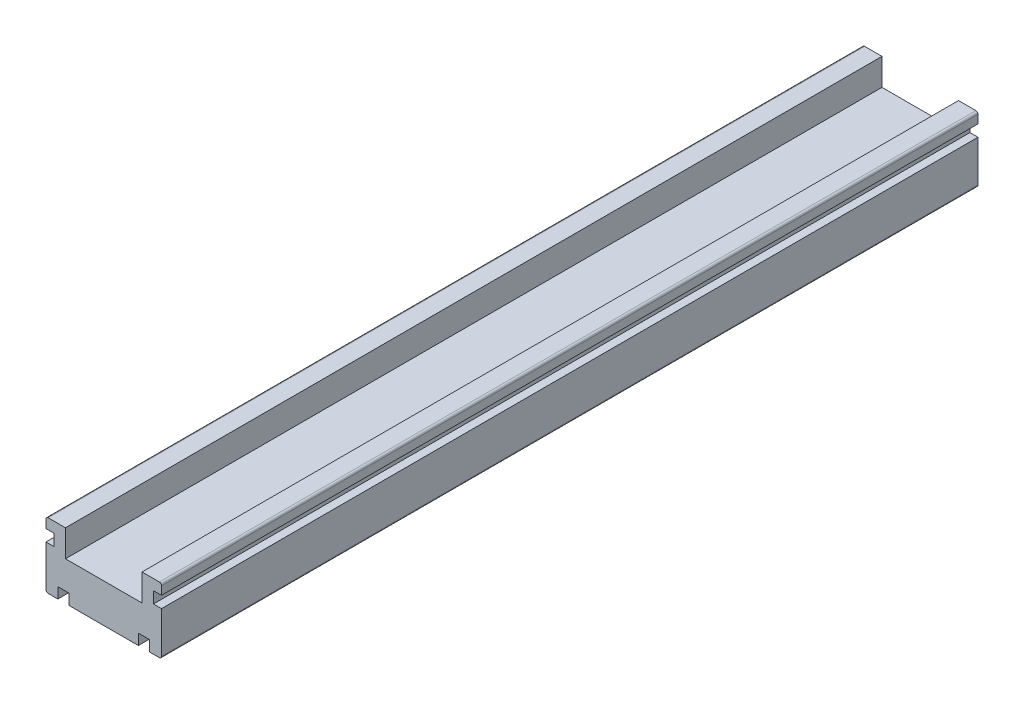
ISO-10303-21;
HEADER;
FILE_DESCRIPTION(('STEP AP214'),'2;1');
FILE_NAME('part.step','',(''),(''),'','','');
FILE_SCHEMA(('AUTOMOTIVE_DESIGN { 1 0 10303 214 1 1 1 1 }'));
ENDSEC;
DATA;
#1=APPLICATION_CONTEXT('core data for automotive mechanical design processes');
#2=APPLICATION_PROTOCOL_DEFINITION('international standard','automotive_design',2000,#1);
#3=PRODUCT_CONTEXT('',#1,'mechanical');
#4=PRODUCT('Part','Part','',(#3));
#5=PRODUCT_RELATED_PRODUCT_CATEGORY('part','',(#4));
#6=PRODUCT_DEFINITION_FORMATION('','',#4);
#7=PRODUCT_DEFINITION_CONTEXT('part definition',#1,'design');
#8=PRODUCT_DEFINITION('design','',#6,#7);
#9=PRODUCT_DEFINITION_SHAPE('','',#8);
#10=(LENGTH_UNIT() NAMED_UNIT(*) SI_UNIT(.MILLI.,.METRE.));
#11=(NAMED_UNIT(*) PLANE_ANGLE_UNIT() SI_UNIT($,.RADIAN.));
#12=(NAMED_UNIT(*) SI_UNIT($,.STERADIAN.) SOLID_ANGLE_UNIT());
#13=UNCERTAINTY_MEASURE_WITH_UNIT(LENGTH_MEASURE(1.E-05),#10,'distance_accuracy_value','');
#14=(GEOMETRIC_REPRESENTATION_CONTEXT(3) GLOBAL_UNCERTAINTY_ASSIGNED_CONTEXT((#13)) GLOBAL_UNIT_ASSIGNED_CONTEXT((#10,
#11,#12)) REPRESENTATION_CONTEXT('',''));
#15=CARTESIAN_POINT('',(0.,0.,0.));
#16=DIRECTION('',(0.,0.,1.));
#17=DIRECTION('',(1.,0.,0.));
#18=AXIS2_PLACEMENT_3D('',#15,#16,#17);
#19=CARTESIAN_POINT('',(-21.5,-12.2,304.));
#20=DIRECTION('',(0.,1.,0.));
#21=DIRECTION('',(0.,0.,1.));
#22=AXIS2_PLACEMENT_3D('',#19,#20,#21);
#23=PLANE('',#22);
#24=DIRECTION('',(1.,0.,0.));
#25=VECTOR('',#24,1.);
#26=CARTESIAN_POINT('',(-21.5,-12.2,0.));
#27=LINE('',#26,#25);
#28=CARTESIAN_POINT('',(-12.9,-12.2,0.));
#29=VERTEX_POINT('',#28);
#30=CARTESIAN_POINT('',(12.9,-12.2,0.));
#31=VERTEX_POINT('',#30);
#32=EDGE_CURVE('E387',#29,#31,#27,.T.);
#33=ORIENTED_EDGE('',*,*,#32,.T.);
#34=DIRECTION('',(0.,0.,1.));
#35=VECTOR('',#34,1.);
#36=CARTESIAN_POINT('',(12.9,-12.2,304.));
#37=LINE('',#36,#35);
#38=CARTESIAN_POINT('',(12.9,-12.2,304.));
#39=VERTEX_POINT('',#38);
#40=EDGE_CURVE('E274',#31,#39,#37,.T.);
#41=ORIENTED_EDGE('',*,*,#40,.T.);
#42=DIRECTION('',(1.,0.,0.));
#43=VECTOR('',#42,1.);
#44=CARTESIAN_POINT('',(-21.5,-12.2,304.));
#45=LINE('',#44,#43);
#46=CARTESIAN_POINT('',(-12.9,-12.2,304.));
#47=VERTEX_POINT('',#46);
#48=EDGE_CURVE('E241',#47,#39,#45,.T.);
#49=ORIENTED_EDGE('',*,*,#48,.F.);
#50=DIRECTION('',(0.,0.,-1.));
#51=VECTOR('',#50,1.);
#52=CARTESIAN_POINT('',(-12.9,-12.2,304.));
#53=LINE('',#52,#51);
#54=EDGE_CURVE('E250',#47,#29,#53,.T.);
#55=ORIENTED_EDGE('',*,*,#54,.T.);
#56=EDGE_LOOP('',(#33,#41,#49,#55));
#57=FACE_BOUND('',#56,.T.);
#58=ADVANCED_FACE('F37',(#57),#23,.F.);
#59=CARTESIAN_POINT('',(-20.7,-12.2,0.));
#60=VERTEX_POINT('',#59);
#61=CARTESIAN_POINT('',(-17.1,-12.2,0.));
#62=VERTEX_POINT('',#61);
#63=EDGE_CURVE('E384',#60,#62,#27,.T.);
#64=ORIENTED_EDGE('',*,*,#63,.T.);
#65=DIRECTION('',(0.,0.,1.));
#66=VECTOR('',#65,1.);
#67=CARTESIAN_POINT('',(-17.1,-12.2,304.));
#68=LINE('',#67,#66);
#69=CARTESIAN_POINT('',(-17.1,-12.2,304.));
#70=VERTEX_POINT('',#69);
#71=EDGE_CURVE('E268',#62,#70,#68,.T.);
#72=ORIENTED_EDGE('',*,*,#71,.T.);
#73=CARTESIAN_POINT('',(-20.7,-12.2,304.));
#74=VERTEX_POINT('',#73);
#75=EDGE_CURVE('E368',#74,#70,#45,.T.);
#76=ORIENTED_EDGE('',*,*,#75,.F.);
#77=DIRECTION('',(0.,0.,-1.));
#78=VECTOR('',#77,1.);
#79=CARTESIAN_POINT('',(-20.7,-12.2,304.));
#80=LINE('',#79,#78);
#81=EDGE_CURVE('E405',#74,#60,#80,.T.);
#82=ORIENTED_EDGE('',*,*,#81,.T.);
#83=EDGE_LOOP('',(#64,#72,#76,#82));
#84=FACE_BOUND('',#83,.T.);
#85=ADVANCED_FACE('F445',(#84),#23,.F.);
#86=CARTESIAN_POINT('',(-21.5,12.2,304.));
#87=DIRECTION('',(0.,-1.,0.));
#88=DIRECTION('',(0.,0.,-1.));
#89=AXIS2_PLACEMENT_3D('',#86,#87,#88);
#90=PLANE('',#89);
#91=DIRECTION('',(-1.,0.,0.));
#92=VECTOR('',#91,1.);
#93=CARTESIAN_POINT('',(-21.5,12.2,304.));
#94=LINE('',#93,#92);
#95=CARTESIAN_POINT('',(-14.25,12.2,304.));
#96=VERTEX_POINT('',#95);
#97=CARTESIAN_POINT('',(-20.7,12.2,304.));
#98=VERTEX_POINT('',#97);
#99=EDGE_CURVE('E358',#96,#98,#94,.T.);
#100=ORIENTED_EDGE('',*,*,#99,.F.);
#101=DIRECTION('',(0.,0.,-1.));
#102=VECTOR('',#101,1.);
#103=CARTESIAN_POINT('',(-14.25,12.2,304.));
#104=LINE('',#103,#102);
#105=CARTESIAN_POINT('',(-14.25,12.2,0.));
#106=VERTEX_POINT('',#105);
#107=EDGE_CURVE('E294',#96,#106,#104,.T.);
#108=ORIENTED_EDGE('',*,*,#107,.T.);
#109=DIRECTION('',(-1.,0.,0.));
#110=VECTOR('',#109,1.);
#111=CARTESIAN_POINT('',(-21.5,12.2,0.));
#112=LINE('',#111,#110);
#113=CARTESIAN_POINT('',(-20.7,12.2,0.));
#114=VERTEX_POINT('',#113);
#115=EDGE_CURVE('E375',#106,#114,#112,.T.);
#116=ORIENTED_EDGE('',*,*,#115,.T.);
#117=DIRECTION('',(0.,0.,-1.));
#118=VECTOR('',#117,1.);
#119=CARTESIAN_POINT('',(-20.7,12.2,304.));
#120=LINE('',#119,#118);
#121=EDGE_CURVE('E428',#114,#98,#120,.F.);
#122=ORIENTED_EDGE('',*,*,#121,.T.);
#123=EDGE_LOOP('',(#100,#108,#116,#122));
#124=FACE_BOUND('',#123,.T.);
#125=ADVANCED_FACE('F480',(#124),#90,.F.);
#126=CARTESIAN_POINT('',(21.5,-12.2,304.));
#127=DIRECTION('',(-1.,0.,0.));
#128=DIRECTION('',(0.,0.,1.));
#129=AXIS2_PLACEMENT_3D('',#126,#127,#128);
#130=PLANE('',#129);
#131=DIRECTION('',(0.,1.,0.));
#132=VECTOR('',#131,1.);
#133=CARTESIAN_POINT('',(21.5,-12.2,304.));
#134=LINE('',#133,#132);
#135=CARTESIAN_POINT('',(21.5,8.3,304.));
#136=VERTEX_POINT('',#135);
#137=CARTESIAN_POINT('',(21.5,11.4,304.));
#138=VERTEX_POINT('',#137);
#139=EDGE_CURVE('E359',#136,#138,#134,.T.);
#140=ORIENTED_EDGE('',*,*,#139,.F.);
#141=DIRECTION('',(0.,0.,-1.));
#142=VECTOR('',#141,1.);
#143=CARTESIAN_POINT('',(21.5,8.3,304.));
#144=LINE('',#143,#142);
#145=CARTESIAN_POINT('',(21.5,8.3,0.));
#146=VERTEX_POINT('',#145);
#147=EDGE_CURVE('E322',#136,#146,#144,.T.);
#148=ORIENTED_EDGE('',*,*,#147,.T.);
#149=DIRECTION('',(0.,1.,0.));
#150=VECTOR('',#149,1.);
#151=CARTESIAN_POINT('',(21.5,-12.2,0.));
#152=LINE('',#151,#150);
#153=CARTESIAN_POINT('',(21.5,11.4,0.));
#154=VERTEX_POINT('',#153);
#155=EDGE_CURVE('E325',#146,#154,#152,.T.);
#156=ORIENTED_EDGE('',*,*,#155,.T.);
#157=DIRECTION('',(0.,0.,-1.));
#158=VECTOR('',#157,1.);
#159=CARTESIAN_POINT('',(21.5,11.4,304.));
#160=LINE('',#159,#158);
#161=EDGE_CURVE('E371',#154,#138,#160,.F.);
#162=ORIENTED_EDGE('',*,*,#161,.T.);
#163=EDGE_LOOP('',(#140,#148,#156,#162));
#164=FACE_BOUND('',#163,.T.);
#165=ADVANCED_FACE('F503',(#164),#130,.F.);
#166=CARTESIAN_POINT('',(-21.5,-12.2,304.));
#167=DIRECTION('',(1.,0.,0.));
#168=DIRECTION('',(0.,0.,-1.));
#169=AXIS2_PLACEMENT_3D('',#166,#167,#168);
#170=PLANE('',#169);
#171=DIRECTION('',(0.,-1.,0.));
#172=VECTOR('',#171,1.);
#173=CARTESIAN_POINT('',(-21.5,-12.2,0.));
#174=LINE('',#173,#172);
#175=CARTESIAN_POINT('',(-21.5,11.4,0.));
#176=VERTEX_POINT('',#175);
#177=CARTESIAN_POINT('',(-21.5,8.3,0.));
#178=VERTEX_POINT('',#177);
#179=EDGE_CURVE('E380',#176,#178,#174,.T.);
#180=ORIENTED_EDGE('',*,*,#179,.T.);
#181=DIRECTION('',(0.,0.,-1.));
#182=VECTOR('',#181,1.);
#183=CARTESIAN_POINT('',(-21.5,8.3,304.));
#184=LINE('',#183,#182);
#185=CARTESIAN_POINT('',(-21.5,8.3,304.));
#186=VERTEX_POINT('',#185);
#187=EDGE_CURVE('E318',#186,#178,#184,.T.);
#188=ORIENTED_EDGE('',*,*,#187,.F.);
#189=DIRECTION('',(0.,-1.,0.));
#190=VECTOR('',#189,1.);
#191=CARTESIAN_POINT('',(-21.5,-12.2,304.));
#192=LINE('',#191,#190);
#193=CARTESIAN_POINT('',(-21.5,11.4,304.));
#194=VERTEX_POINT('',#193);
#195=EDGE_CURVE('E364',#194,#186,#192,.T.);
#196=ORIENTED_EDGE('',*,*,#195,.F.);
#197=DIRECTION('',(0.,0.,-1.));
#198=VECTOR('',#197,1.);
#199=CARTESIAN_POINT('',(-21.5,11.4,304.));
#200=LINE('',#199,#198);
#201=EDGE_CURVE('E419',#194,#176,#200,.T.);
#202=ORIENTED_EDGE('',*,*,#201,.T.);
#203=EDGE_LOOP('',(#180,#188,#196,#202));
#204=FACE_BOUND('',#203,.T.);
#205=ADVANCED_FACE('F468',(#204),#170,.F.);
#206=CARTESIAN_POINT('',(21.5,-11.4,0.));
#207=VERTEX_POINT('',#206);
#208=CARTESIAN_POINT('',(21.5,4.,0.));
#209=VERTEX_POINT('',#208);
#210=EDGE_CURVE('E372',#207,#209,#152,.T.);
#211=ORIENTED_EDGE('',*,*,#210,.T.);
#212=DIRECTION('',(0.,0.,-1.));
#213=VECTOR('',#212,1.);
#214=CARTESIAN_POINT('',(21.5,4.,304.));
#215=LINE('',#214,#213);
#216=CARTESIAN_POINT('',(21.5,4.,304.));
#217=VERTEX_POINT('',#216);
#218=EDGE_CURVE('E313',#217,#209,#215,.T.);
#219=ORIENTED_EDGE('',*,*,#218,.F.);
#220=CARTESIAN_POINT('',(21.5,-11.4,304.));
#221=VERTEX_POINT('',#220);
#222=EDGE_CURVE('E355',#221,#217,#134,.T.);
#223=ORIENTED_EDGE('',*,*,#222,.F.);
#224=DIRECTION('',(0.,0.,-1.));
#225=VECTOR('',#224,1.);
#226=CARTESIAN_POINT('',(21.5,-11.4,304.));
#227=LINE('',#226,#225);
#228=EDGE_CURVE('E390',#221,#207,#227,.T.);
#229=ORIENTED_EDGE('',*,*,#228,.T.);
#230=EDGE_LOOP('',(#211,#219,#223,#229));
#231=FACE_BOUND('',#230,.T.);
#232=ADVANCED_FACE('F515',(#231),#130,.F.);
#233=CARTESIAN_POINT('',(20.7,12.2,0.));
#234=VERTEX_POINT('',#233);
#235=CARTESIAN_POINT('',(14.25,12.2,0.));
#236=VERTEX_POINT('',#235);
#237=EDGE_CURVE('E376',#234,#236,#112,.T.);
#238=ORIENTED_EDGE('',*,*,#237,.T.);
#239=DIRECTION('',(0.,0.,-1.));
#240=VECTOR('',#239,1.);
#241=CARTESIAN_POINT('',(14.25,12.2,304.));
#242=LINE('',#241,#240);
#243=CARTESIAN_POINT('',(14.25,12.2,304.));
#244=VERTEX_POINT('',#243);
#245=EDGE_CURVE('E287',#244,#236,#242,.T.);
#246=ORIENTED_EDGE('',*,*,#245,.F.);
#247=CARTESIAN_POINT('',(20.7,12.2,304.));
#248=VERTEX_POINT('',#247);
#249=EDGE_CURVE('E360',#248,#244,#94,.T.);
#250=ORIENTED_EDGE('',*,*,#249,.F.);
#251=DIRECTION('',(0.,0.,-1.));
#252=VECTOR('',#251,1.);
#253=CARTESIAN_POINT('',(20.7,12.2,304.));
#254=LINE('',#253,#252);
#255=EDGE_CURVE('E425',#248,#234,#254,.T.);
#256=ORIENTED_EDGE('',*,*,#255,.T.);
#257=EDGE_LOOP('',(#238,#246,#250,#256));
#258=FACE_BOUND('',#257,.T.);
#259=ADVANCED_FACE('F492',(#258),#90,.F.);
#260=CARTESIAN_POINT('',(-21.5,4.,304.));
#261=VERTEX_POINT('',#260);
#262=CARTESIAN_POINT('',(-21.5,-11.4,304.));
#263=VERTEX_POINT('',#262);
#264=EDGE_CURVE('E363',#261,#263,#192,.T.);
#265=ORIENTED_EDGE('',*,*,#264,.F.);
#266=DIRECTION('',(0.,0.,-1.));
#267=VECTOR('',#266,1.);
#268=CARTESIAN_POINT('',(-21.5,4.,304.));
#269=LINE('',#268,#267);
#270=CARTESIAN_POINT('',(-21.5,4.,0.));
#271=VERTEX_POINT('',#270);
#272=EDGE_CURVE('E348',#261,#271,#269,.T.);
#273=ORIENTED_EDGE('',*,*,#272,.T.);
#274=CARTESIAN_POINT('',(-21.5,-11.4,0.));
#275=VERTEX_POINT('',#274);
#276=EDGE_CURVE('E379',#271,#275,#174,.T.);
#277=ORIENTED_EDGE('',*,*,#276,.T.);
#278=DIRECTION('',(0.,0.,-1.));
#279=VECTOR('',#278,1.);
#280=CARTESIAN_POINT('',(-21.5,-11.4,304.));
#281=LINE('',#280,#279);
#282=EDGE_CURVE('E422',#275,#263,#281,.F.);
#283=ORIENTED_EDGE('',*,*,#282,.T.);
#284=EDGE_LOOP('',(#265,#273,#277,#283));
#285=FACE_BOUND('',#284,.T.);
#286=ADVANCED_FACE('F455',(#285),#170,.F.);
#287=CARTESIAN_POINT('',(17.1,-12.2,304.));
#288=VERTEX_POINT('',#287);
#289=CARTESIAN_POINT('',(20.7,-12.2,304.));
#290=VERTEX_POINT('',#289);
#291=EDGE_CURVE('E367',#288,#290,#45,.T.);
#292=ORIENTED_EDGE('',*,*,#291,.F.);
#293=DIRECTION('',(0.,0.,-1.));
#294=VECTOR('',#293,1.);
#295=CARTESIAN_POINT('',(17.1,-12.2,304.));
#296=LINE('',#295,#294);
#297=CARTESIAN_POINT('',(17.1,-12.2,0.));
#298=VERTEX_POINT('',#297);
#299=EDGE_CURVE('E271',#288,#298,#296,.T.);
#300=ORIENTED_EDGE('',*,*,#299,.T.);
#301=CARTESIAN_POINT('',(20.7,-12.2,0.));
#302=VERTEX_POINT('',#301);
#303=EDGE_CURVE('E383',#298,#302,#27,.T.);
#304=ORIENTED_EDGE('',*,*,#303,.T.);
#305=DIRECTION('',(0.,0.,-1.));
#306=VECTOR('',#305,1.);
#307=CARTESIAN_POINT('',(20.7,-12.2,304.));
#308=LINE('',#307,#306);
#309=EDGE_CURVE('E408',#302,#290,#308,.F.);
#310=ORIENTED_EDGE('',*,*,#309,.T.);
#311=EDGE_LOOP('',(#292,#300,#304,#310));
#312=FACE_BOUND('',#311,.T.);
#313=ADVANCED_FACE('F528',(#312),#23,.F.);
#314=CARTESIAN_POINT('',(0.,0.,304.));
#315=DIRECTION('',(0.,0.,-1.));
#316=DIRECTION('',(-1.,0.,0.));
#317=AXIS2_PLACEMENT_3D('',#314,#315,#316);
#318=PLANE('',#317);
#319=ORIENTED_EDGE('',*,*,#48,.T.);
#320=DIRECTION('',(0.,1.,0.));
#321=VECTOR('',#320,1.);
#322=CARTESIAN_POINT('',(12.9,-16.2,304.));
#323=LINE('',#322,#321);
#324=CARTESIAN_POINT('',(12.9,-8.2,304.));
#325=VERTEX_POINT('',#324);
#326=EDGE_CURVE('E223',#39,#325,#323,.T.);
#327=ORIENTED_EDGE('',*,*,#326,.T.);
#328=DIRECTION('',(1.,0.,0.));
#329=VECTOR('',#328,1.);
#330=CARTESIAN_POINT('',(17.1,-8.2,304.));
#331=LINE('',#330,#329);
#332=CARTESIAN_POINT('',(17.1,-8.2,304.));
#333=VERTEX_POINT('',#332);
#334=EDGE_CURVE('E231',#325,#333,#331,.T.);
#335=ORIENTED_EDGE('',*,*,#334,.T.);
#336=DIRECTION('',(0.,-1.,0.));
#337=VECTOR('',#336,1.);
#338=CARTESIAN_POINT('',(17.1,-16.2,304.));
#339=LINE('',#338,#337);
#340=EDGE_CURVE('E228',#333,#288,#339,.T.);
#341=ORIENTED_EDGE('',*,*,#340,.T.);
#342=ORIENTED_EDGE('',*,*,#291,.T.);
#343=CARTESIAN_POINT('',(20.7,-11.4,304.));
#344=DIRECTION('',(0.,0.,-1.));
#345=DIRECTION('',(-1.,0.,0.));
#346=AXIS2_PLACEMENT_3D('',#343,#344,#345);
#347=CIRCLE('',#346,0.8);
#348=EDGE_CURVE('E417',#290,#221,#347,.F.);
#349=ORIENTED_EDGE('',*,*,#348,.T.);
#350=ORIENTED_EDGE('',*,*,#222,.T.);
#351=DIRECTION('',(-1.,0.,0.));
#352=VECTOR('',#351,1.);
#353=CARTESIAN_POINT('',(21.5,4.,304.));
#354=LINE('',#353,#352);
#355=CARTESIAN_POINT('',(18.5,4.,304.));
#356=VERTEX_POINT('',#355);
#357=EDGE_CURVE('E303',#217,#356,#354,.T.);
#358=ORIENTED_EDGE('',*,*,#357,.T.);
#359=DIRECTION('',(0.,1.,0.));
#360=VECTOR('',#359,1.);
#361=CARTESIAN_POINT('',(18.5,8.3,304.));
#362=LINE('',#361,#360);
#363=CARTESIAN_POINT('',(18.5,8.3,304.));
#364=VERTEX_POINT('',#363);
#365=EDGE_CURVE('E306',#356,#364,#362,.T.);
#366=ORIENTED_EDGE('',*,*,#365,.T.);
#367=DIRECTION('',(1.,0.,0.));
#368=VECTOR('',#367,1.);
#369=CARTESIAN_POINT('',(21.5,8.3,304.));
#370=LINE('',#369,#368);
#371=EDGE_CURVE('E310',#364,#136,#370,.T.);
#372=ORIENTED_EDGE('',*,*,#371,.T.);
#373=ORIENTED_EDGE('',*,*,#139,.T.);
#374=CARTESIAN_POINT('',(20.7,11.4,304.));
#375=DIRECTION('',(0.,0.,-1.));
#376=DIRECTION('',(-1.,0.,0.));
#377=AXIS2_PLACEMENT_3D('',#374,#375,#376);
#378=CIRCLE('',#377,0.8);
#379=EDGE_CURVE('E411',#138,#248,#378,.F.);
#380=ORIENTED_EDGE('',*,*,#379,.T.);
#381=ORIENTED_EDGE('',*,*,#249,.T.);
#382=DIRECTION('',(0.,-1.,0.));
#383=VECTOR('',#382,1.);
#384=CARTESIAN_POINT('',(14.25,12.2,304.));
#385=LINE('',#384,#383);
#386=CARTESIAN_POINT('',(14.25,2.2,304.));
#387=VERTEX_POINT('',#386);
#388=EDGE_CURVE('E277',#244,#387,#385,.T.);
#389=ORIENTED_EDGE('',*,*,#388,.T.);
#390=DIRECTION('',(-1.,0.,0.));
#391=VECTOR('',#390,1.);
#392=CARTESIAN_POINT('',(14.25,2.2,304.));
#393=LINE('',#392,#391);
#394=CARTESIAN_POINT('',(-14.25,2.2,304.));
#395=VERTEX_POINT('',#394);
#396=EDGE_CURVE('E280',#387,#395,#393,.T.);
#397=ORIENTED_EDGE('',*,*,#396,.T.);
#398=DIRECTION('',(0.,1.,0.));
#399=VECTOR('',#398,1.);
#400=CARTESIAN_POINT('',(-14.25,2.2,304.));
#401=LINE('',#400,#399);
#402=EDGE_CURVE('E284',#395,#96,#401,.T.);
#403=ORIENTED_EDGE('',*,*,#402,.T.);
#404=ORIENTED_EDGE('',*,*,#99,.T.);
#405=CARTESIAN_POINT('',(-20.7,11.4,304.));
#406=DIRECTION('',(0.,0.,-1.));
#407=DIRECTION('',(-1.,0.,0.));
#408=AXIS2_PLACEMENT_3D('',#405,#406,#407);
#409=CIRCLE('',#408,0.8);
#410=EDGE_CURVE('E413',#98,#194,#409,.F.);
#411=ORIENTED_EDGE('',*,*,#410,.T.);
#412=ORIENTED_EDGE('',*,*,#195,.T.);
#413=DIRECTION('',(1.,0.,0.));
#414=VECTOR('',#413,1.);
#415=CARTESIAN_POINT('',(-21.5,8.3,304.));
#416=LINE('',#415,#414);
#417=CARTESIAN_POINT('',(-18.5,8.3,304.));
#418=VERTEX_POINT('',#417);
#419=EDGE_CURVE('E331',#186,#418,#416,.T.);
#420=ORIENTED_EDGE('',*,*,#419,.T.);
#421=DIRECTION('',(0.,-1.,0.));
#422=VECTOR('',#421,1.);
#423=CARTESIAN_POINT('',(-18.5,8.3,304.));
#424=LINE('',#423,#422);
#425=CARTESIAN_POINT('',(-18.5,4.,304.));
#426=VERTEX_POINT('',#425);
#427=EDGE_CURVE('E334',#418,#426,#424,.T.);
#428=ORIENTED_EDGE('',*,*,#427,.T.);
#429=DIRECTION('',(-1.,0.,0.));
#430=VECTOR('',#429,1.);
#431=CARTESIAN_POINT('',(-21.5,4.,304.));
#432=LINE('',#431,#430);
#433=EDGE_CURVE('E338',#426,#261,#432,.T.);
#434=ORIENTED_EDGE('',*,*,#433,.T.);
#435=ORIENTED_EDGE('',*,*,#264,.T.);
#436=CARTESIAN_POINT('',(-20.7,-11.4,304.));
#437=DIRECTION('',(0.,0.,-1.));
#438=DIRECTION('',(-1.,0.,0.));
#439=AXIS2_PLACEMENT_3D('',#436,#437,#438);
#440=CIRCLE('',#439,0.8);
#441=EDGE_CURVE('E415',#263,#74,#440,.F.);
#442=ORIENTED_EDGE('',*,*,#441,.T.);
#443=ORIENTED_EDGE('',*,*,#75,.T.);
#444=DIRECTION('',(0.,1.,0.));
#445=VECTOR('',#444,1.);
#446=CARTESIAN_POINT('',(-17.1,-16.2,304.));
#447=LINE('',#446,#445);
#448=CARTESIAN_POINT('',(-17.1,-8.2,304.));
#449=VERTEX_POINT('',#448);
#450=EDGE_CURVE('E252',#70,#449,#447,.T.);
#451=ORIENTED_EDGE('',*,*,#450,.T.);
#452=DIRECTION('',(1.,0.,0.));
#453=VECTOR('',#452,1.);
#454=CARTESIAN_POINT('',(-12.9,-8.2,304.));
#455=LINE('',#454,#453);
#456=CARTESIAN_POINT('',(-12.9,-8.2,304.));
#457=VERTEX_POINT('',#456);
#458=EDGE_CURVE('E255',#449,#457,#455,.T.);
#459=ORIENTED_EDGE('',*,*,#458,.T.);
#460=DIRECTION('',(0.,-1.,0.));
#461=VECTOR('',#460,1.);
#462=CARTESIAN_POINT('',(-12.9,-16.2,304.));
#463=LINE('',#462,#461);
#464=EDGE_CURVE('E259',#457,#47,#463,.T.);
#465=ORIENTED_EDGE('',*,*,#464,.T.);
#466=EDGE_LOOP('',(#319,#327,#335,#341,#342,#349,#350,#358,#366,#372,#373,#380,#381,#389,#397,
#403,#404,#411,#412,#420,#428,#434,#435,#442,#443,#451,#459,#465));
#467=FACE_BOUND('',#466,.T.);
#468=ADVANCED_FACE('F238',(#467),#318,.F.);
#469=CARTESIAN_POINT('',(0.,0.,0.));
#470=DIRECTION('',(0.,0.,-1.));
#471=DIRECTION('',(-1.,0.,0.));
#472=AXIS2_PLACEMENT_3D('',#469,#470,#471);
#473=PLANE('',#472);
#474=DIRECTION('',(0.,1.,0.));
#475=VECTOR('',#474,1.);
#476=CARTESIAN_POINT('',(12.9,0.,0.));
#477=LINE('',#476,#475);
#478=CARTESIAN_POINT('',(12.9,-8.2,0.));
#479=VERTEX_POINT('',#478);
#480=EDGE_CURVE('E11',#31,#479,#477,.T.);
#481=ORIENTED_EDGE('',*,*,#480,.F.);
#482=ORIENTED_EDGE('',*,*,#32,.F.);
#483=DIRECTION('',(0.,-1.,0.));
#484=VECTOR('',#483,1.);
#485=CARTESIAN_POINT('',(-12.9,-16.2,0.));
#486=LINE('',#485,#484);
#487=CARTESIAN_POINT('',(-12.9,-8.2,0.));
#488=VERTEX_POINT('',#487);
#489=EDGE_CURVE('E256',#488,#29,#486,.T.);
#490=ORIENTED_EDGE('',*,*,#489,.F.);
#491=DIRECTION('',(1.,0.,0.));
#492=VECTOR('',#491,1.);
#493=CARTESIAN_POINT('',(-12.9,-8.2,0.));
#494=LINE('',#493,#492);
#495=CARTESIAN_POINT('',(-17.1,-8.2,0.));
#496=VERTEX_POINT('',#495);
#497=EDGE_CURVE('E261',#496,#488,#494,.T.);
#498=ORIENTED_EDGE('',*,*,#497,.F.);
#499=DIRECTION('',(0.,1.,0.));
#500=VECTOR('',#499,1.);
#501=CARTESIAN_POINT('',(-17.1,0.,0.));
#502=LINE('',#501,#500);
#503=EDGE_CURVE('E45',#62,#496,#502,.T.);
#504=ORIENTED_EDGE('',*,*,#503,.F.);
#505=ORIENTED_EDGE('',*,*,#63,.F.);
#506=CARTESIAN_POINT('',(-20.7,-11.4,0.));
#507=DIRECTION('',(0.,0.,-1.));
#508=DIRECTION('',(-1.,0.,0.));
#509=AXIS2_PLACEMENT_3D('',#506,#507,#508);
#510=CIRCLE('',#509,0.8);
#511=EDGE_CURVE('E399',#60,#275,#510,.T.);
#512=ORIENTED_EDGE('',*,*,#511,.T.);
#513=ORIENTED_EDGE('',*,*,#276,.F.);
#514=DIRECTION('',(-1.,0.,0.));
#515=VECTOR('',#514,1.);
#516=CARTESIAN_POINT('',(-21.5,4.,0.));
#517=LINE('',#516,#515);
#518=CARTESIAN_POINT('',(-18.5,4.,0.));
#519=VERTEX_POINT('',#518);
#520=EDGE_CURVE('E335',#519,#271,#517,.T.);
#521=ORIENTED_EDGE('',*,*,#520,.F.);
#522=DIRECTION('',(0.,-1.,0.));
#523=VECTOR('',#522,1.);
#524=CARTESIAN_POINT('',(-18.5,8.3,0.));
#525=LINE('',#524,#523);
#526=CARTESIAN_POINT('',(-18.5,8.3,0.));
#527=VERTEX_POINT('',#526);
#528=EDGE_CURVE('E343',#527,#519,#525,.T.);
#529=ORIENTED_EDGE('',*,*,#528,.F.);
#530=DIRECTION('',(1.,0.,0.));
#531=VECTOR('',#530,1.);
#532=CARTESIAN_POINT('',(-21.5,8.3,0.));
#533=LINE('',#532,#531);
#534=EDGE_CURVE('E297',#178,#527,#533,.T.);
#535=ORIENTED_EDGE('',*,*,#534,.F.);
#536=ORIENTED_EDGE('',*,*,#179,.F.);
#537=CARTESIAN_POINT('',(-20.7,11.4,0.));
#538=DIRECTION('',(0.,0.,-1.));
#539=DIRECTION('',(-1.,0.,0.));
#540=AXIS2_PLACEMENT_3D('',#537,#538,#539);
#541=CIRCLE('',#540,0.8);
#542=EDGE_CURVE('E396',#176,#114,#541,.T.);
#543=ORIENTED_EDGE('',*,*,#542,.T.);
#544=ORIENTED_EDGE('',*,*,#115,.F.);
#545=DIRECTION('',(0.,1.,0.));
#546=VECTOR('',#545,1.);
#547=CARTESIAN_POINT('',(-14.25,2.2,0.));
#548=LINE('',#547,#546);
#549=CARTESIAN_POINT('',(-14.25,2.2,0.));
#550=VERTEX_POINT('',#549);
#551=EDGE_CURVE('E281',#550,#106,#548,.T.);
#552=ORIENTED_EDGE('',*,*,#551,.F.);
#553=DIRECTION('',(-1.,0.,0.));
#554=VECTOR('',#553,1.);
#555=CARTESIAN_POINT('',(14.25,2.2,0.));
#556=LINE('',#555,#554);
#557=CARTESIAN_POINT('',(14.25,2.2,0.));
#558=VERTEX_POINT('',#557);
#559=EDGE_CURVE('E290',#558,#550,#556,.T.);
#560=ORIENTED_EDGE('',*,*,#559,.F.);
#561=DIRECTION('',(0.,-1.,0.));
#562=VECTOR('',#561,1.);
#563=CARTESIAN_POINT('',(14.25,12.2,0.));
#564=LINE('',#563,#562);
#565=EDGE_CURVE('E276',#236,#558,#564,.T.);
#566=ORIENTED_EDGE('',*,*,#565,.F.);
#567=ORIENTED_EDGE('',*,*,#237,.F.);
#568=CARTESIAN_POINT('',(20.7,11.4,0.));
#569=DIRECTION('',(0.,0.,-1.));
#570=DIRECTION('',(-1.,0.,0.));
#571=AXIS2_PLACEMENT_3D('',#568,#569,#570);
#572=CIRCLE('',#571,0.8);
#573=EDGE_CURVE('E393',#234,#154,#572,.T.);
#574=ORIENTED_EDGE('',*,*,#573,.T.);
#575=ORIENTED_EDGE('',*,*,#155,.F.);
#576=DIRECTION('',(1.,0.,0.));
#577=VECTOR('',#576,1.);
#578=CARTESIAN_POINT('',(21.5,8.3,0.));
#579=LINE('',#578,#577);
#580=CARTESIAN_POINT('',(18.5,8.3,0.));
#581=VERTEX_POINT('',#580);
#582=EDGE_CURVE('E307',#581,#146,#579,.T.);
#583=ORIENTED_EDGE('',*,*,#582,.F.);
#584=DIRECTION('',(0.,1.,0.));
#585=VECTOR('',#584,1.);
#586=CARTESIAN_POINT('',(18.5,8.3,0.));
#587=LINE('',#586,#585);
#588=CARTESIAN_POINT('',(18.5,4.,0.));
#589=VERTEX_POINT('',#588);
#590=EDGE_CURVE('E317',#589,#581,#587,.T.);
#591=ORIENTED_EDGE('',*,*,#590,.F.);
#592=DIRECTION('',(-1.,0.,0.));
#593=VECTOR('',#592,1.);
#594=CARTESIAN_POINT('',(21.5,4.,0.));
#595=LINE('',#594,#593);
#596=EDGE_CURVE('E314',#209,#589,#595,.T.);
#597=ORIENTED_EDGE('',*,*,#596,.F.);
#598=ORIENTED_EDGE('',*,*,#210,.F.);
#599=CARTESIAN_POINT('',(20.7,-11.4,0.));
#600=DIRECTION('',(0.,0.,-1.));
#601=DIRECTION('',(-1.,0.,0.));
#602=AXIS2_PLACEMENT_3D('',#599,#600,#601);
#603=CIRCLE('',#602,0.8);
#604=EDGE_CURVE('E402',#207,#302,#603,.T.);
#605=ORIENTED_EDGE('',*,*,#604,.T.);
#606=ORIENTED_EDGE('',*,*,#303,.F.);
#607=DIRECTION('',(0.,-1.,0.));
#608=VECTOR('',#607,1.);
#609=CARTESIAN_POINT('',(17.1,-16.2,0.));
#610=LINE('',#609,#608);
#611=CARTESIAN_POINT('',(17.1,-8.2,0.));
#612=VERTEX_POINT('',#611);
#613=EDGE_CURVE('E242',#612,#298,#610,.T.);
#614=ORIENTED_EDGE('',*,*,#613,.F.);
#615=DIRECTION('',(1.,0.,0.));
#616=VECTOR('',#615,1.);
#617=CARTESIAN_POINT('',(17.1,-8.2,0.));
#618=LINE('',#617,#616);
#619=EDGE_CURVE('E244',#479,#612,#618,.T.);
#620=ORIENTED_EDGE('',*,*,#619,.F.);
#621=EDGE_LOOP('',(#481,#482,#490,#498,#504,#505,#512,#513,#521,#529,#535,#536,#543,#544,#552,
#560,#566,#567,#574,#575,#583,#591,#597,#598,#605,#606,#614,#620));
#622=FACE_BOUND('',#621,.T.);
#623=ADVANCED_FACE('F437',(#622),#473,.T.);
#624=CARTESIAN_POINT('',(20.7,-11.4,304.));
#625=DIRECTION('',(0.,0.,-1.));
#626=DIRECTION('',(-1.,0.,0.));
#627=AXIS2_PLACEMENT_3D('',#624,#625,#626);
#628=CYLINDRICAL_SURFACE('',#627,0.8);
#629=ORIENTED_EDGE('',*,*,#348,.F.);
#630=ORIENTED_EDGE('',*,*,#309,.F.);
#631=ORIENTED_EDGE('',*,*,#604,.F.);
#632=ORIENTED_EDGE('',*,*,#228,.F.);
#633=EDGE_LOOP('',(#629,#630,#631,#632));
#634=FACE_BOUND('',#633,.T.);
#635=ADVANCED_FACE('F520',(#634),#628,.T.);
#636=CARTESIAN_POINT('',(-20.7,-11.4,304.));
#637=DIRECTION('',(0.,0.,-1.));
#638=DIRECTION('',(-1.,0.,0.));
#639=AXIS2_PLACEMENT_3D('',#636,#637,#638);
#640=CYLINDRICAL_SURFACE('',#639,0.8);
#641=ORIENTED_EDGE('',*,*,#441,.F.);
#642=ORIENTED_EDGE('',*,*,#282,.F.);
#643=ORIENTED_EDGE('',*,*,#511,.F.);
#644=ORIENTED_EDGE('',*,*,#81,.F.);
#645=EDGE_LOOP('',(#641,#642,#643,#644));
#646=FACE_BOUND('',#645,.T.);
#647=ADVANCED_FACE('F452',(#646),#640,.T.);
#648=CARTESIAN_POINT('',(-20.7,11.4,304.));
#649=DIRECTION('',(0.,0.,-1.));
#650=DIRECTION('',(-1.,0.,0.));
#651=AXIS2_PLACEMENT_3D('',#648,#649,#650);
#652=CYLINDRICAL_SURFACE('',#651,0.8);
#653=ORIENTED_EDGE('',*,*,#410,.F.);
#654=ORIENTED_EDGE('',*,*,#121,.F.);
#655=ORIENTED_EDGE('',*,*,#542,.F.);
#656=ORIENTED_EDGE('',*,*,#201,.F.);
#657=EDGE_LOOP('',(#653,#654,#655,#656));
#658=FACE_BOUND('',#657,.T.);
#659=ADVANCED_FACE('F473',(#658),#652,.T.);
#660=CARTESIAN_POINT('',(20.7,11.4,304.));
#661=DIRECTION('',(0.,0.,-1.));
#662=DIRECTION('',(-1.,0.,0.));
#663=AXIS2_PLACEMENT_3D('',#660,#661,#662);
#664=CYLINDRICAL_SURFACE('',#663,0.8);
#665=ORIENTED_EDGE('',*,*,#379,.F.);
#666=ORIENTED_EDGE('',*,*,#161,.F.);
#667=ORIENTED_EDGE('',*,*,#573,.F.);
#668=ORIENTED_EDGE('',*,*,#255,.F.);
#669=EDGE_LOOP('',(#665,#666,#667,#668));
#670=FACE_BOUND('',#669,.T.);
#671=ADVANCED_FACE('F39',(#670),#664,.T.);
#672=CARTESIAN_POINT('',(-21.5,8.3,304.));
#673=DIRECTION('',(0.,1.,0.));
#674=DIRECTION('',(0.,0.,1.));
#675=AXIS2_PLACEMENT_3D('',#672,#673,#674);
#676=PLANE('',#675);
#677=ORIENTED_EDGE('',*,*,#534,.T.);
#678=DIRECTION('',(0.,0.,-1.));
#679=VECTOR('',#678,1.);
#680=CARTESIAN_POINT('',(-18.5,8.3,304.));
#681=LINE('',#680,#679);
#682=EDGE_CURVE('E341',#418,#527,#681,.T.);
#683=ORIENTED_EDGE('',*,*,#682,.F.);
#684=ORIENTED_EDGE('',*,*,#419,.F.);
#685=ORIENTED_EDGE('',*,*,#187,.T.);
#686=EDGE_LOOP('',(#677,#683,#684,#685));
#687=FACE_BOUND('',#686,.T.);
#688=ADVANCED_FACE('F565',(#687),#676,.F.);
#689=CARTESIAN_POINT('',(-21.5,4.,304.));
#690=DIRECTION('',(0.,-1.,0.));
#691=DIRECTION('',(1.,0.,0.));
#692=AXIS2_PLACEMENT_3D('',#689,#690,#691);
#693=PLANE('',#692);
#694=ORIENTED_EDGE('',*,*,#520,.T.);
#695=ORIENTED_EDGE('',*,*,#272,.F.);
#696=ORIENTED_EDGE('',*,*,#433,.F.);
#697=DIRECTION('',(0.,0.,-1.));
#698=VECTOR('',#697,1.);
#699=CARTESIAN_POINT('',(-18.5,4.,304.));
#700=LINE('',#699,#698);
#701=EDGE_CURVE('E351',#426,#519,#700,.T.);
#702=ORIENTED_EDGE('',*,*,#701,.T.);
#703=EDGE_LOOP('',(#694,#695,#696,#702));
#704=FACE_BOUND('',#703,.T.);
#705=ADVANCED_FACE('F458',(#704),#693,.F.);
#706=CARTESIAN_POINT('',(-18.5,8.3,304.));
#707=DIRECTION('',(1.,0.,0.));
#708=DIRECTION('',(0.,0.,-1.));
#709=AXIS2_PLACEMENT_3D('',#706,#707,#708);
#710=PLANE('',#709);
#711=ORIENTED_EDGE('',*,*,#528,.T.);
#712=ORIENTED_EDGE('',*,*,#701,.F.);
#713=ORIENTED_EDGE('',*,*,#427,.F.);
#714=ORIENTED_EDGE('',*,*,#682,.T.);
#715=EDGE_LOOP('',(#711,#712,#713,#714));
#716=FACE_BOUND('',#715,.T.);
#717=ADVANCED_FACE('F461',(#716),#710,.F.);
#718=CARTESIAN_POINT('',(21.5,8.3,304.));
#719=DIRECTION('',(0.,1.,0.));
#720=DIRECTION('',(0.,0.,1.));
#721=AXIS2_PLACEMENT_3D('',#718,#719,#720);
#722=PLANE('',#721);
#723=ORIENTED_EDGE('',*,*,#582,.T.);
#724=ORIENTED_EDGE('',*,*,#147,.F.);
#725=ORIENTED_EDGE('',*,*,#371,.F.);
#726=DIRECTION('',(0.,0.,-1.));
#727=VECTOR('',#726,1.);
#728=CARTESIAN_POINT('',(18.5,8.3,304.));
#729=LINE('',#728,#727);
#730=EDGE_CURVE('E326',#364,#581,#729,.T.);
#731=ORIENTED_EDGE('',*,*,#730,.T.);
#732=EDGE_LOOP('',(#723,#724,#725,#731));
#733=FACE_BOUND('',#732,.T.);
#734=ADVANCED_FACE('F506',(#733),#722,.F.);
#735=CARTESIAN_POINT('',(18.5,8.3,304.));
#736=DIRECTION('',(-1.,0.,0.));
#737=DIRECTION('',(0.,0.,1.));
#738=AXIS2_PLACEMENT_3D('',#735,#736,#737);
#739=PLANE('',#738);
#740=ORIENTED_EDGE('',*,*,#590,.T.);
#741=ORIENTED_EDGE('',*,*,#730,.F.);
#742=ORIENTED_EDGE('',*,*,#365,.F.);
#743=DIRECTION('',(0.,0.,-1.));
#744=VECTOR('',#743,1.);
#745=CARTESIAN_POINT('',(18.5,4.,304.));
#746=LINE('',#745,#744);
#747=EDGE_CURVE('E328',#356,#589,#746,.T.);
#748=ORIENTED_EDGE('',*,*,#747,.T.);
#749=EDGE_LOOP('',(#740,#741,#742,#748));
#750=FACE_BOUND('',#749,.T.);
#751=ADVANCED_FACE('F509',(#750),#739,.F.);
#752=CARTESIAN_POINT('',(21.5,4.,304.));
#753=DIRECTION('',(0.,-1.,0.));
#754=DIRECTION('',(0.,0.,-1.));
#755=AXIS2_PLACEMENT_3D('',#752,#753,#754);
#756=PLANE('',#755);
#757=ORIENTED_EDGE('',*,*,#596,.T.);
#758=ORIENTED_EDGE('',*,*,#747,.F.);
#759=ORIENTED_EDGE('',*,*,#357,.F.);
#760=ORIENTED_EDGE('',*,*,#218,.T.);
#761=EDGE_LOOP('',(#757,#758,#759,#760));
#762=FACE_BOUND('',#761,.T.);
#763=ADVANCED_FACE('F625',(#762),#756,.F.);
#764=CARTESIAN_POINT('',(-14.25,2.2,304.));
#765=DIRECTION('',(-1.,0.,0.));
#766=DIRECTION('',(0.,-1.,0.));
#767=AXIS2_PLACEMENT_3D('',#764,#765,#766);
#768=PLANE('',#767);
#769=ORIENTED_EDGE('',*,*,#551,.T.);
#770=ORIENTED_EDGE('',*,*,#107,.F.);
#771=ORIENTED_EDGE('',*,*,#402,.F.);
#772=DIRECTION('',(0.,0.,-1.));
#773=VECTOR('',#772,1.);
#774=CARTESIAN_POINT('',(-14.25,2.2,304.));
#775=LINE('',#774,#773);
#776=EDGE_CURVE('E298',#395,#550,#775,.T.);
#777=ORIENTED_EDGE('',*,*,#776,.T.);
#778=EDGE_LOOP('',(#769,#770,#771,#777));
#779=FACE_BOUND('',#778,.T.);
#780=ADVANCED_FACE('F483',(#779),#768,.F.);
#781=CARTESIAN_POINT('',(14.25,2.2,304.));
#782=DIRECTION('',(0.,-1.,0.));
#783=DIRECTION('',(0.,0.,-1.));
#784=AXIS2_PLACEMENT_3D('',#781,#782,#783);
#785=PLANE('',#784);
#786=ORIENTED_EDGE('',*,*,#559,.T.);
#787=ORIENTED_EDGE('',*,*,#776,.F.);
#788=ORIENTED_EDGE('',*,*,#396,.F.);
#789=DIRECTION('',(0.,0.,-1.));
#790=VECTOR('',#789,1.);
#791=CARTESIAN_POINT('',(14.25,2.2,304.));
#792=LINE('',#791,#790);
#793=EDGE_CURVE('E300',#387,#558,#792,.T.);
#794=ORIENTED_EDGE('',*,*,#793,.T.);
#795=EDGE_LOOP('',(#786,#787,#788,#794));
#796=FACE_BOUND('',#795,.T.);
#797=ADVANCED_FACE('F486',(#796),#785,.F.);
#798=CARTESIAN_POINT('',(14.25,12.2,304.));
#799=DIRECTION('',(1.,0.,0.));
#800=DIRECTION('',(0.,1.,0.));
#801=AXIS2_PLACEMENT_3D('',#798,#799,#800);
#802=PLANE('',#801);
#803=ORIENTED_EDGE('',*,*,#565,.T.);
#804=ORIENTED_EDGE('',*,*,#793,.F.);
#805=ORIENTED_EDGE('',*,*,#388,.F.);
#806=ORIENTED_EDGE('',*,*,#245,.T.);
#807=EDGE_LOOP('',(#803,#804,#805,#806));
#808=FACE_BOUND('',#807,.T.);
#809=ADVANCED_FACE('F587',(#808),#802,.F.);
#810=CARTESIAN_POINT('',(-17.1,-16.2,304.));
#811=DIRECTION('',(-1.,0.,0.));
#812=DIRECTION('',(0.,0.,1.));
#813=AXIS2_PLACEMENT_3D('',#810,#811,#812);
#814=PLANE('',#813);
#815=ORIENTED_EDGE('',*,*,#503,.T.);
#816=DIRECTION('',(0.,0.,-1.));
#817=VECTOR('',#816,1.);
#818=CARTESIAN_POINT('',(-17.1,-8.2,304.));
#819=LINE('',#818,#817);
#820=EDGE_CURVE('E59',#449,#496,#819,.T.);
#821=ORIENTED_EDGE('',*,*,#820,.F.);
#822=ORIENTED_EDGE('',*,*,#450,.F.);
#823=ORIENTED_EDGE('',*,*,#71,.F.);
#824=EDGE_LOOP('',(#815,#821,#822,#823));
#825=FACE_BOUND('',#824,.T.);
#826=ADVANCED_FACE('F433',(#825),#814,.F.);
#827=CARTESIAN_POINT('',(-12.9,-16.2,304.));
#828=DIRECTION('',(1.,0.,0.));
#829=DIRECTION('',(0.,1.,0.));
#830=AXIS2_PLACEMENT_3D('',#827,#828,#829);
#831=PLANE('',#830);
#832=ORIENTED_EDGE('',*,*,#464,.F.);
#833=DIRECTION('',(0.,0.,-1.));
#834=VECTOR('',#833,1.);
#835=CARTESIAN_POINT('',(-12.9,-8.2,304.));
#836=LINE('',#835,#834);
#837=EDGE_CURVE('E248',#457,#488,#836,.T.);
#838=ORIENTED_EDGE('',*,*,#837,.T.);
#839=ORIENTED_EDGE('',*,*,#489,.T.);
#840=ORIENTED_EDGE('',*,*,#54,.F.);
#841=EDGE_LOOP('',(#832,#838,#839,#840));
#842=FACE_BOUND('',#841,.T.);
#843=ADVANCED_FACE('F442',(#842),#831,.F.);
#844=CARTESIAN_POINT('',(-12.9,-8.2,304.));
#845=DIRECTION('',(0.,1.,0.));
#846=DIRECTION('',(0.,0.,1.));
#847=AXIS2_PLACEMENT_3D('',#844,#845,#846);
#848=PLANE('',#847);
#849=ORIENTED_EDGE('',*,*,#497,.T.);
#850=ORIENTED_EDGE('',*,*,#837,.F.);
#851=ORIENTED_EDGE('',*,*,#458,.F.);
#852=ORIENTED_EDGE('',*,*,#820,.T.);
#853=EDGE_LOOP('',(#849,#850,#851,#852));
#854=FACE_BOUND('',#853,.T.);
#855=ADVANCED_FACE('F439',(#854),#848,.F.);
#856=CARTESIAN_POINT('',(12.9,-16.2,304.));
#857=DIRECTION('',(-1.,0.,0.));
#858=DIRECTION('',(0.,0.,1.));
#859=AXIS2_PLACEMENT_3D('',#856,#857,#858);
#860=PLANE('',#859);
#861=ORIENTED_EDGE('',*,*,#480,.T.);
#862=DIRECTION('',(0.,0.,-1.));
#863=VECTOR('',#862,1.);
#864=CARTESIAN_POINT('',(12.9,-8.2,304.));
#865=LINE('',#864,#863);
#866=EDGE_CURVE('E52',#325,#479,#865,.T.);
#867=ORIENTED_EDGE('',*,*,#866,.F.);
#868=ORIENTED_EDGE('',*,*,#326,.F.);
#869=ORIENTED_EDGE('',*,*,#40,.F.);
#870=EDGE_LOOP('',(#861,#867,#868,#869));
#871=FACE_BOUND('',#870,.T.);
#872=ADVANCED_FACE('F221',(#871),#860,.F.);
#873=CARTESIAN_POINT('',(17.1,-16.2,304.));
#874=DIRECTION('',(1.,0.,0.));
#875=DIRECTION('',(0.,0.,-1.));
#876=AXIS2_PLACEMENT_3D('',#873,#874,#875);
#877=PLANE('',#876);
#878=ORIENTED_EDGE('',*,*,#340,.F.);
#879=DIRECTION('',(0.,0.,-1.));
#880=VECTOR('',#879,1.);
#881=CARTESIAN_POINT('',(17.1,-8.2,304.));
#882=LINE('',#881,#880);
#883=EDGE_CURVE('E227',#333,#612,#882,.T.);
#884=ORIENTED_EDGE('',*,*,#883,.T.);
#885=ORIENTED_EDGE('',*,*,#613,.T.);
#886=ORIENTED_EDGE('',*,*,#299,.F.);
#887=EDGE_LOOP('',(#878,#884,#885,#886));
#888=FACE_BOUND('',#887,.T.);
#889=ADVANCED_FACE('F607',(#888),#877,.F.);
#890=CARTESIAN_POINT('',(17.1,-8.2,304.));
#891=DIRECTION('',(0.,1.,0.));
#892=DIRECTION('',(0.,0.,1.));
#893=AXIS2_PLACEMENT_3D('',#890,#891,#892);
#894=PLANE('',#893);
#895=ORIENTED_EDGE('',*,*,#619,.T.);
#896=ORIENTED_EDGE('',*,*,#883,.F.);
#897=ORIENTED_EDGE('',*,*,#334,.F.);
#898=ORIENTED_EDGE('',*,*,#866,.T.);
#899=EDGE_LOOP('',(#895,#896,#897,#898));
#900=FACE_BOUND('',#899,.T.);
#901=ADVANCED_FACE('F232',(#900),#894,.F.);
#902=CLOSED_SHELL('',(#58,#85,#125,#165,#205,#232,#259,#286,#313,#468,#623,#635,#647,#659,#671,
#688,#705,#717,#734,#751,#763,#780,#797,#809,#826,#843,#855,#872,#889,#901));
#903=MANIFOLD_SOLID_BREP('B2',#902);
#904=ADVANCED_BREP_SHAPE_REPRESENTATION('',(#18,#903),#14);
#905=SHAPE_DEFINITION_REPRESENTATION(#9,#904);
ENDSEC;
END-ISO-10303-21;
